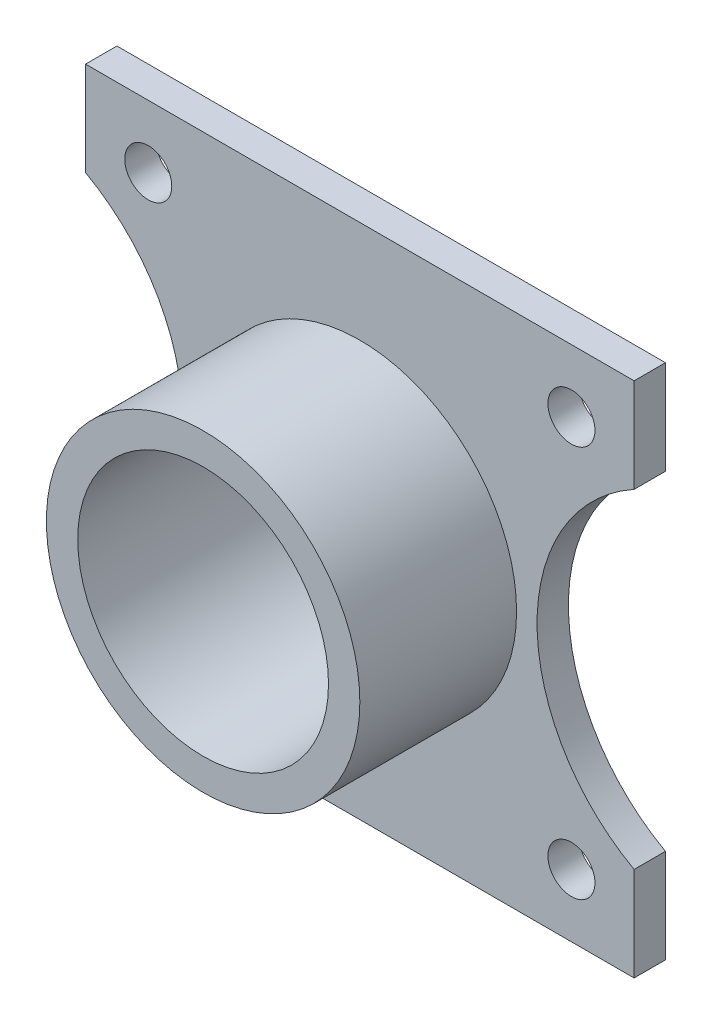
ISO-10303-21;
HEADER;
FILE_DESCRIPTION(('STEP AP214'),'2;1');
FILE_NAME('part.step','',(''),(''),'','','');
FILE_SCHEMA(('AUTOMOTIVE_DESIGN { 1 0 10303 214 1 1 1 1 }'));
ENDSEC;
DATA;
#1=APPLICATION_CONTEXT('core data for automotive mechanical design processes');
#2=APPLICATION_PROTOCOL_DEFINITION('international standard','automotive_design',2000,#1);
#3=PRODUCT_CONTEXT('',#1,'mechanical');
#4=PRODUCT('Part','Part','',(#3));
#5=PRODUCT_RELATED_PRODUCT_CATEGORY('part','',(#4));
#6=PRODUCT_DEFINITION_FORMATION('','',#4);
#7=PRODUCT_DEFINITION_CONTEXT('part definition',#1,'design');
#8=PRODUCT_DEFINITION('design','',#6,#7);
#9=PRODUCT_DEFINITION_SHAPE('','',#8);
#10=(LENGTH_UNIT() NAMED_UNIT(*) SI_UNIT(.MILLI.,.METRE.));
#11=(NAMED_UNIT(*) PLANE_ANGLE_UNIT() SI_UNIT($,.RADIAN.));
#12=(NAMED_UNIT(*) SI_UNIT($,.STERADIAN.) SOLID_ANGLE_UNIT());
#13=UNCERTAINTY_MEASURE_WITH_UNIT(LENGTH_MEASURE(1.E-05),#10,'distance_accuracy_value','');
#14=(GEOMETRIC_REPRESENTATION_CONTEXT(3) GLOBAL_UNCERTAINTY_ASSIGNED_CONTEXT((#13)) GLOBAL_UNIT_ASSIGNED_CONTEXT((#10,
#11,#12)) REPRESENTATION_CONTEXT('',''));
#15=CARTESIAN_POINT('',(0.,0.,0.));
#16=DIRECTION('',(0.,0.,1.));
#17=DIRECTION('',(1.,0.,0.));
#18=AXIS2_PLACEMENT_3D('',#15,#16,#17);
#19=CARTESIAN_POINT('',(23.3094750193111,0.,2.));
#20=DIRECTION('',(0.,0.,-1.));
#21=DIRECTION('',(-1.,0.,0.));
#22=AXIS2_PLACEMENT_3D('',#19,#20,#21);
#23=CYLINDRICAL_SURFACE('',#22,12.);
#24=CARTESIAN_POINT('',(23.3094750193111,0.,0.));
#25=DIRECTION('',(0.,0.,1.));
#26=DIRECTION('',(1.,0.,0.));
#27=AXIS2_PLACEMENT_3D('',#24,#25,#26);
#28=CIRCLE('',#27,12.);
#29=CARTESIAN_POINT('',(17.5,10.5,0.));
#30=VERTEX_POINT('',#29);
#31=CARTESIAN_POINT('',(17.5,-10.5,0.));
#32=VERTEX_POINT('',#31);
#33=EDGE_CURVE('E164',#30,#32,#28,.T.);
#34=ORIENTED_EDGE('',*,*,#33,.F.);
#35=DIRECTION('',(0.,0.,-1.));
#36=VECTOR('',#35,1.);
#37=CARTESIAN_POINT('',(17.5,10.5,2.));
#38=LINE('',#37,#36);
#39=CARTESIAN_POINT('',(17.5,10.5,2.));
#40=VERTEX_POINT('',#39);
#41=EDGE_CURVE('E48',#40,#30,#38,.T.);
#42=ORIENTED_EDGE('',*,*,#41,.F.);
#43=CARTESIAN_POINT('',(23.3094750193111,0.,2.));
#44=DIRECTION('',(0.,0.,1.));
#45=DIRECTION('',(1.,0.,0.));
#46=AXIS2_PLACEMENT_3D('',#43,#44,#45);
#47=CIRCLE('',#46,12.);
#48=CARTESIAN_POINT('',(17.5,-10.5,2.));
#49=VERTEX_POINT('',#48);
#50=EDGE_CURVE('E208',#40,#49,#47,.T.);
#51=ORIENTED_EDGE('',*,*,#50,.T.);
#52=DIRECTION('',(0.,0.,-1.));
#53=VECTOR('',#52,1.);
#54=CARTESIAN_POINT('',(17.5,-10.5,2.));
#55=LINE('',#54,#53);
#56=EDGE_CURVE('E63',#49,#32,#55,.T.);
#57=ORIENTED_EDGE('',*,*,#56,.T.);
#58=EDGE_LOOP('',(#34,#42,#51,#57));
#59=FACE_BOUND('',#58,.T.);
#60=ADVANCED_FACE('F45',(#59),#23,.F.);
#61=CARTESIAN_POINT('',(17.5,0.,2.));
#62=DIRECTION('',(1.,0.,0.));
#63=DIRECTION('',(0.,0.,-1.));
#64=AXIS2_PLACEMENT_3D('',#61,#62,#63);
#65=PLANE('',#64);
#66=DIRECTION('',(0.,-1.,0.));
#67=VECTOR('',#66,1.);
#68=CARTESIAN_POINT('',(17.5,0.,0.));
#69=LINE('',#68,#67);
#70=CARTESIAN_POINT('',(17.5,16.5,0.));
#71=VERTEX_POINT('',#70);
#72=EDGE_CURVE('E167',#71,#30,#69,.T.);
#73=ORIENTED_EDGE('',*,*,#72,.F.);
#74=DIRECTION('',(0.,0.,-1.));
#75=VECTOR('',#74,1.);
#76=CARTESIAN_POINT('',(17.5,16.5,2.));
#77=LINE('',#76,#75);
#78=CARTESIAN_POINT('',(17.5,16.5,2.));
#79=VERTEX_POINT('',#78);
#80=EDGE_CURVE('E220',#79,#71,#77,.T.);
#81=ORIENTED_EDGE('',*,*,#80,.F.);
#82=DIRECTION('',(0.,-1.,0.));
#83=VECTOR('',#82,1.);
#84=CARTESIAN_POINT('',(17.5,0.,2.));
#85=LINE('',#84,#83);
#86=EDGE_CURVE('E146',#79,#40,#85,.T.);
#87=ORIENTED_EDGE('',*,*,#86,.T.);
#88=ORIENTED_EDGE('',*,*,#41,.T.);
#89=EDGE_LOOP('',(#73,#81,#87,#88));
#90=FACE_BOUND('',#89,.T.);
#91=ADVANCED_FACE('F229',(#90),#65,.T.);
#92=CARTESIAN_POINT('',(0.,16.5,2.));
#93=DIRECTION('',(0.,1.,0.));
#94=DIRECTION('',(0.,0.,1.));
#95=AXIS2_PLACEMENT_3D('',#92,#93,#94);
#96=PLANE('',#95);
#97=DIRECTION('',(1.,0.,0.));
#98=VECTOR('',#97,1.);
#99=CARTESIAN_POINT('',(0.,16.5,0.));
#100=LINE('',#99,#98);
#101=CARTESIAN_POINT('',(-17.5,16.5,0.));
#102=VERTEX_POINT('',#101);
#103=EDGE_CURVE('E172',#102,#71,#100,.T.);
#104=ORIENTED_EDGE('',*,*,#103,.F.);
#105=DIRECTION('',(0.,0.,-1.));
#106=VECTOR('',#105,1.);
#107=CARTESIAN_POINT('',(-17.5,16.5,2.));
#108=LINE('',#107,#106);
#109=CARTESIAN_POINT('',(-17.5,16.5,2.));
#110=VERTEX_POINT('',#109);
#111=EDGE_CURVE('E218',#110,#102,#108,.T.);
#112=ORIENTED_EDGE('',*,*,#111,.F.);
#113=DIRECTION('',(1.,0.,0.));
#114=VECTOR('',#113,1.);
#115=CARTESIAN_POINT('',(0.,16.5,2.));
#116=LINE('',#115,#114);
#117=EDGE_CURVE('E239',#110,#79,#116,.T.);
#118=ORIENTED_EDGE('',*,*,#117,.T.);
#119=ORIENTED_EDGE('',*,*,#80,.T.);
#120=EDGE_LOOP('',(#104,#112,#118,#119));
#121=FACE_BOUND('',#120,.T.);
#122=ADVANCED_FACE('F237',(#121),#96,.T.);
#123=CARTESIAN_POINT('',(-17.5,0.,2.));
#124=DIRECTION('',(-1.,0.,0.));
#125=DIRECTION('',(0.,0.,1.));
#126=AXIS2_PLACEMENT_3D('',#123,#124,#125);
#127=PLANE('',#126);
#128=DIRECTION('',(0.,1.,0.));
#129=VECTOR('',#128,1.);
#130=CARTESIAN_POINT('',(-17.5,0.,0.));
#131=LINE('',#130,#129);
#132=CARTESIAN_POINT('',(-17.5,10.5,0.));
#133=VERTEX_POINT('',#132);
#134=EDGE_CURVE('E177',#133,#102,#131,.T.);
#135=ORIENTED_EDGE('',*,*,#134,.F.);
#136=DIRECTION('',(0.,0.,-1.));
#137=VECTOR('',#136,1.);
#138=CARTESIAN_POINT('',(-17.5,10.5,2.));
#139=LINE('',#138,#137);
#140=CARTESIAN_POINT('',(-17.5,10.5,2.));
#141=VERTEX_POINT('',#140);
#142=EDGE_CURVE('E215',#141,#133,#139,.T.);
#143=ORIENTED_EDGE('',*,*,#142,.F.);
#144=DIRECTION('',(0.,1.,0.));
#145=VECTOR('',#144,1.);
#146=CARTESIAN_POINT('',(-17.5,0.,2.));
#147=LINE('',#146,#145);
#148=EDGE_CURVE('E138',#141,#110,#147,.T.);
#149=ORIENTED_EDGE('',*,*,#148,.T.);
#150=ORIENTED_EDGE('',*,*,#111,.T.);
#151=EDGE_LOOP('',(#135,#143,#149,#150));
#152=FACE_BOUND('',#151,.T.);
#153=ADVANCED_FACE('F244',(#152),#127,.T.);
#154=CARTESIAN_POINT('',(-23.3094750193111,0.,2.));
#155=DIRECTION('',(0.,0.,-1.));
#156=DIRECTION('',(-1.,0.,0.));
#157=AXIS2_PLACEMENT_3D('',#154,#155,#156);
#158=CYLINDRICAL_SURFACE('',#157,12.);
#159=CARTESIAN_POINT('',(-23.3094750193111,0.,0.));
#160=DIRECTION('',(0.,0.,1.));
#161=DIRECTION('',(1.,0.,0.));
#162=AXIS2_PLACEMENT_3D('',#159,#160,#161);
#163=CIRCLE('',#162,12.);
#164=CARTESIAN_POINT('',(-17.5,-10.5,0.));
#165=VERTEX_POINT('',#164);
#166=EDGE_CURVE('E181',#133,#165,#163,.F.);
#167=ORIENTED_EDGE('',*,*,#166,.T.);
#168=DIRECTION('',(0.,0.,-1.));
#169=VECTOR('',#168,1.);
#170=CARTESIAN_POINT('',(-17.5,-10.5,2.));
#171=LINE('',#170,#169);
#172=CARTESIAN_POINT('',(-17.5,-10.5,2.));
#173=VERTEX_POINT('',#172);
#174=EDGE_CURVE('E124',#173,#165,#171,.T.);
#175=ORIENTED_EDGE('',*,*,#174,.F.);
#176=CARTESIAN_POINT('',(-23.3094750193111,0.,2.));
#177=DIRECTION('',(0.,0.,1.));
#178=DIRECTION('',(1.,0.,0.));
#179=AXIS2_PLACEMENT_3D('',#176,#177,#178);
#180=CIRCLE('',#179,12.);
#181=EDGE_CURVE('E134',#141,#173,#180,.F.);
#182=ORIENTED_EDGE('',*,*,#181,.F.);
#183=ORIENTED_EDGE('',*,*,#142,.T.);
#184=EDGE_LOOP('',(#167,#175,#182,#183));
#185=FACE_BOUND('',#184,.T.);
#186=ADVANCED_FACE('F297',(#185),#158,.F.);
#187=CARTESIAN_POINT('',(-17.5,-16.5,0.));
#188=VERTEX_POINT('',#187);
#189=EDGE_CURVE('E119',#188,#165,#131,.T.);
#190=ORIENTED_EDGE('',*,*,#189,.F.);
#191=DIRECTION('',(0.,0.,-1.));
#192=VECTOR('',#191,1.);
#193=CARTESIAN_POINT('',(-17.5,-16.5,2.));
#194=LINE('',#193,#192);
#195=CARTESIAN_POINT('',(-17.5,-16.5,2.));
#196=VERTEX_POINT('',#195);
#197=EDGE_CURVE('E114',#196,#188,#194,.T.);
#198=ORIENTED_EDGE('',*,*,#197,.F.);
#199=EDGE_CURVE('E117',#196,#173,#147,.T.);
#200=ORIENTED_EDGE('',*,*,#199,.T.);
#201=ORIENTED_EDGE('',*,*,#174,.T.);
#202=EDGE_LOOP('',(#190,#198,#200,#201));
#203=FACE_BOUND('',#202,.T.);
#204=ADVANCED_FACE('F116',(#203),#127,.T.);
#205=CARTESIAN_POINT('',(0.,-16.5,2.));
#206=DIRECTION('',(0.,-1.,0.));
#207=DIRECTION('',(1.,0.,0.));
#208=AXIS2_PLACEMENT_3D('',#205,#206,#207);
#209=PLANE('',#208);
#210=DIRECTION('',(-1.,0.,0.));
#211=VECTOR('',#210,1.);
#212=CARTESIAN_POINT('',(0.,-16.5,0.));
#213=LINE('',#212,#211);
#214=CARTESIAN_POINT('',(17.5,-16.5,0.));
#215=VERTEX_POINT('',#214);
#216=EDGE_CURVE('E185',#215,#188,#213,.T.);
#217=ORIENTED_EDGE('',*,*,#216,.F.);
#218=DIRECTION('',(0.,0.,-1.));
#219=VECTOR('',#218,1.);
#220=CARTESIAN_POINT('',(17.5,-16.5,2.));
#221=LINE('',#220,#219);
#222=CARTESIAN_POINT('',(17.5,-16.5,2.));
#223=VERTEX_POINT('',#222);
#224=EDGE_CURVE('E89',#223,#215,#221,.T.);
#225=ORIENTED_EDGE('',*,*,#224,.F.);
#226=DIRECTION('',(-1.,0.,0.));
#227=VECTOR('',#226,1.);
#228=CARTESIAN_POINT('',(0.,-16.5,2.));
#229=LINE('',#228,#227);
#230=EDGE_CURVE('E131',#223,#196,#229,.T.);
#231=ORIENTED_EDGE('',*,*,#230,.T.);
#232=ORIENTED_EDGE('',*,*,#197,.T.);
#233=EDGE_LOOP('',(#217,#225,#231,#232));
#234=FACE_BOUND('',#233,.T.);
#235=ADVANCED_FACE('F139',(#234),#209,.T.);
#236=CARTESIAN_POINT('',(-13.5,12.5,2.));
#237=DIRECTION('',(0.,0.,-1.));
#238=DIRECTION('',(-1.,0.,0.));
#239=AXIS2_PLACEMENT_3D('',#236,#237,#238);
#240=CYLINDRICAL_SURFACE('',#239,1.5);
#241=CARTESIAN_POINT('',(-13.5,12.5,2.));
#242=DIRECTION('',(0.,0.,1.));
#243=DIRECTION('',(1.,0.,0.));
#244=AXIS2_PLACEMENT_3D('',#241,#242,#243);
#245=CIRCLE('',#244,1.5);
#246=CARTESIAN_POINT('',(-12.,12.5,2.));
#247=VERTEX_POINT('',#246);
#248=EDGE_CURVE('E156',#247,#247,#245,.T.);
#249=ORIENTED_EDGE('',*,*,#248,.T.);
#250=EDGE_LOOP('',(#249));
#251=FACE_BOUND('',#250,.T.);
#252=CARTESIAN_POINT('',(-13.5,12.5,0.));
#253=DIRECTION('',(0.,0.,1.));
#254=DIRECTION('',(1.,0.,0.));
#255=AXIS2_PLACEMENT_3D('',#252,#253,#254);
#256=CIRCLE('',#255,1.5);
#257=CARTESIAN_POINT('',(-12.,12.5,0.));
#258=VERTEX_POINT('',#257);
#259=EDGE_CURVE('E200',#258,#258,#256,.T.);
#260=ORIENTED_EDGE('',*,*,#259,.F.);
#261=EDGE_LOOP('',(#260));
#262=FACE_BOUND('',#261,.T.);
#263=ADVANCED_FACE('F306',(#251,#262),#240,.F.);
#264=CARTESIAN_POINT('',(-13.5,-12.5,2.));
#265=DIRECTION('',(0.,0.,-1.));
#266=DIRECTION('',(-1.,0.,0.));
#267=AXIS2_PLACEMENT_3D('',#264,#265,#266);
#268=CYLINDRICAL_SURFACE('',#267,1.5);
#269=CARTESIAN_POINT('',(-13.5,-12.5,2.));
#270=DIRECTION('',(0.,0.,1.));
#271=DIRECTION('',(1.,0.,0.));
#272=AXIS2_PLACEMENT_3D('',#269,#270,#271);
#273=CIRCLE('',#272,1.5);
#274=CARTESIAN_POINT('',(-12.,-12.5,2.));
#275=VERTEX_POINT('',#274);
#276=EDGE_CURVE('E152',#275,#275,#273,.T.);
#277=ORIENTED_EDGE('',*,*,#276,.T.);
#278=EDGE_LOOP('',(#277));
#279=FACE_BOUND('',#278,.T.);
#280=CARTESIAN_POINT('',(-13.5,-12.5,0.));
#281=DIRECTION('',(0.,0.,1.));
#282=DIRECTION('',(1.,0.,0.));
#283=AXIS2_PLACEMENT_3D('',#280,#281,#282);
#284=CIRCLE('',#283,1.5);
#285=CARTESIAN_POINT('',(-12.,-12.5,0.));
#286=VERTEX_POINT('',#285);
#287=EDGE_CURVE('E196',#286,#286,#284,.T.);
#288=ORIENTED_EDGE('',*,*,#287,.F.);
#289=EDGE_LOOP('',(#288));
#290=FACE_BOUND('',#289,.T.);
#291=ADVANCED_FACE('F310',(#279,#290),#268,.F.);
#292=CARTESIAN_POINT('',(13.5,-12.5,2.));
#293=DIRECTION('',(0.,0.,-1.));
#294=DIRECTION('',(-1.,0.,0.));
#295=AXIS2_PLACEMENT_3D('',#292,#293,#294);
#296=CYLINDRICAL_SURFACE('',#295,1.5);
#297=CARTESIAN_POINT('',(13.5,-12.5,2.));
#298=DIRECTION('',(0.,0.,1.));
#299=DIRECTION('',(1.,0.,0.));
#300=AXIS2_PLACEMENT_3D('',#297,#298,#299);
#301=CIRCLE('',#300,1.5);
#302=CARTESIAN_POINT('',(15.,-12.5,2.));
#303=VERTEX_POINT('',#302);
#304=EDGE_CURVE('E144',#303,#303,#301,.T.);
#305=ORIENTED_EDGE('',*,*,#304,.T.);
#306=EDGE_LOOP('',(#305));
#307=FACE_BOUND('',#306,.T.);
#308=CARTESIAN_POINT('',(13.5,-12.5,0.));
#309=DIRECTION('',(0.,0.,1.));
#310=DIRECTION('',(1.,0.,0.));
#311=AXIS2_PLACEMENT_3D('',#308,#309,#310);
#312=CIRCLE('',#311,1.5);
#313=CARTESIAN_POINT('',(15.,-12.5,0.));
#314=VERTEX_POINT('',#313);
#315=EDGE_CURVE('E192',#314,#314,#312,.T.);
#316=ORIENTED_EDGE('',*,*,#315,.F.);
#317=EDGE_LOOP('',(#316));
#318=FACE_BOUND('',#317,.T.);
#319=ADVANCED_FACE('F292',(#307,#318),#296,.F.);
#320=CARTESIAN_POINT('',(0.,0.,2.));
#321=DIRECTION('',(0.,0.,-1.));
#322=DIRECTION('',(-1.,0.,0.));
#323=AXIS2_PLACEMENT_3D('',#320,#321,#322);
#324=CYLINDRICAL_SURFACE('',#323,8.);
#325=CARTESIAN_POINT('',(0.,0.,0.));
#326=DIRECTION('',(0.,0.,1.));
#327=DIRECTION('',(1.,0.,0.));
#328=AXIS2_PLACEMENT_3D('',#325,#326,#327);
#329=CIRCLE('',#328,8.);
#330=CARTESIAN_POINT('',(8.,0.,0.));
#331=VERTEX_POINT('',#330);
#332=EDGE_CURVE('E188',#331,#331,#329,.T.);
#333=ORIENTED_EDGE('',*,*,#332,.F.);
#334=EDGE_LOOP('',(#333));
#335=FACE_BOUND('',#334,.T.);
#336=CARTESIAN_POINT('',(0.,0.,12.));
#337=DIRECTION('',(0.,0.,1.));
#338=DIRECTION('',(1.,0.,0.));
#339=AXIS2_PLACEMENT_3D('',#336,#337,#338);
#340=CIRCLE('',#339,8.);
#341=CARTESIAN_POINT('',(8.,0.,12.));
#342=VERTEX_POINT('',#341);
#343=EDGE_CURVE('E254',#342,#342,#340,.T.);
#344=ORIENTED_EDGE('',*,*,#343,.T.);
#345=EDGE_LOOP('',(#344));
#346=FACE_BOUND('',#345,.T.);
#347=ADVANCED_FACE('F259',(#335,#346),#324,.F.);
#348=EDGE_CURVE('E173',#32,#215,#69,.T.);
#349=ORIENTED_EDGE('',*,*,#348,.F.);
#350=ORIENTED_EDGE('',*,*,#56,.F.);
#351=EDGE_CURVE('E141',#49,#223,#85,.T.);
#352=ORIENTED_EDGE('',*,*,#351,.T.);
#353=ORIENTED_EDGE('',*,*,#224,.T.);
#354=EDGE_LOOP('',(#349,#350,#352,#353));
#355=FACE_BOUND('',#354,.T.);
#356=ADVANCED_FACE('F278',(#355),#65,.T.);
#357=CARTESIAN_POINT('',(13.5,12.5,2.));
#358=DIRECTION('',(0.,0.,-1.));
#359=DIRECTION('',(-1.,0.,0.));
#360=AXIS2_PLACEMENT_3D('',#357,#358,#359);
#361=CYLINDRICAL_SURFACE('',#360,1.5);
#362=CARTESIAN_POINT('',(13.5,12.5,2.));
#363=DIRECTION('',(0.,0.,1.));
#364=DIRECTION('',(1.,0.,0.));
#365=AXIS2_PLACEMENT_3D('',#362,#363,#364);
#366=CIRCLE('',#365,1.5);
#367=CARTESIAN_POINT('',(15.,12.5,2.));
#368=VERTEX_POINT('',#367);
#369=EDGE_CURVE('E160',#368,#368,#366,.T.);
#370=ORIENTED_EDGE('',*,*,#369,.T.);
#371=EDGE_LOOP('',(#370));
#372=FACE_BOUND('',#371,.T.);
#373=CARTESIAN_POINT('',(13.5,12.5,0.));
#374=DIRECTION('',(0.,0.,1.));
#375=DIRECTION('',(1.,0.,0.));
#376=AXIS2_PLACEMENT_3D('',#373,#374,#375);
#377=CIRCLE('',#376,1.5);
#378=CARTESIAN_POINT('',(15.,12.5,0.));
#379=VERTEX_POINT('',#378);
#380=EDGE_CURVE('E204',#379,#379,#377,.T.);
#381=ORIENTED_EDGE('',*,*,#380,.F.);
#382=EDGE_LOOP('',(#381));
#383=FACE_BOUND('',#382,.T.);
#384=ADVANCED_FACE('F285',(#372,#383),#361,.F.);
#385=CARTESIAN_POINT('',(0.,0.,2.));
#386=DIRECTION('',(0.,0.,1.));
#387=DIRECTION('',(1.,0.,0.));
#388=AXIS2_PLACEMENT_3D('',#385,#386,#387);
#389=PLANE('',#388);
#390=CARTESIAN_POINT('',(0.,0.,2.));
#391=DIRECTION('',(0.,0.,1.));
#392=DIRECTION('',(1.,0.,0.));
#393=AXIS2_PLACEMENT_3D('',#390,#391,#392);
#394=CIRCLE('',#393,10.);
#395=CARTESIAN_POINT('',(10.,0.,2.));
#396=VERTEX_POINT('',#395);
#397=EDGE_CURVE('E11',#396,#396,#394,.T.);
#398=ORIENTED_EDGE('',*,*,#397,.F.);
#399=EDGE_LOOP('',(#398));
#400=FACE_BOUND('',#399,.T.);
#401=ORIENTED_EDGE('',*,*,#50,.F.);
#402=ORIENTED_EDGE('',*,*,#86,.F.);
#403=ORIENTED_EDGE('',*,*,#117,.F.);
#404=ORIENTED_EDGE('',*,*,#148,.F.);
#405=ORIENTED_EDGE('',*,*,#181,.T.);
#406=ORIENTED_EDGE('',*,*,#199,.F.);
#407=ORIENTED_EDGE('',*,*,#230,.F.);
#408=ORIENTED_EDGE('',*,*,#351,.F.);
#409=EDGE_LOOP('',(#401,#402,#403,#404,#405,#406,#407,#408));
#410=FACE_BOUND('',#409,.T.);
#411=ORIENTED_EDGE('',*,*,#304,.F.);
#412=EDGE_LOOP('',(#411));
#413=FACE_BOUND('',#412,.T.);
#414=ORIENTED_EDGE('',*,*,#276,.F.);
#415=EDGE_LOOP('',(#414));
#416=FACE_BOUND('',#415,.T.);
#417=ORIENTED_EDGE('',*,*,#248,.F.);
#418=EDGE_LOOP('',(#417));
#419=FACE_BOUND('',#418,.T.);
#420=ORIENTED_EDGE('',*,*,#369,.F.);
#421=EDGE_LOOP('',(#420));
#422=FACE_BOUND('',#421,.T.);
#423=ADVANCED_FACE('F128',(#400,#410,#413,#416,#419,#422),#389,.T.);
#424=CARTESIAN_POINT('',(0.,0.,0.));
#425=DIRECTION('',(0.,0.,1.));
#426=DIRECTION('',(1.,0.,0.));
#427=AXIS2_PLACEMENT_3D('',#424,#425,#426);
#428=PLANE('',#427);
#429=ORIENTED_EDGE('',*,*,#33,.T.);
#430=ORIENTED_EDGE('',*,*,#348,.T.);
#431=ORIENTED_EDGE('',*,*,#216,.T.);
#432=ORIENTED_EDGE('',*,*,#189,.T.);
#433=ORIENTED_EDGE('',*,*,#166,.F.);
#434=ORIENTED_EDGE('',*,*,#134,.T.);
#435=ORIENTED_EDGE('',*,*,#103,.T.);
#436=ORIENTED_EDGE('',*,*,#72,.T.);
#437=EDGE_LOOP('',(#429,#430,#431,#432,#433,#434,#435,#436));
#438=FACE_BOUND('',#437,.T.);
#439=ORIENTED_EDGE('',*,*,#332,.T.);
#440=EDGE_LOOP('',(#439));
#441=FACE_BOUND('',#440,.T.);
#442=ORIENTED_EDGE('',*,*,#315,.T.);
#443=EDGE_LOOP('',(#442));
#444=FACE_BOUND('',#443,.T.);
#445=ORIENTED_EDGE('',*,*,#287,.T.);
#446=EDGE_LOOP('',(#445));
#447=FACE_BOUND('',#446,.T.);
#448=ORIENTED_EDGE('',*,*,#259,.T.);
#449=EDGE_LOOP('',(#448));
#450=FACE_BOUND('',#449,.T.);
#451=ORIENTED_EDGE('',*,*,#380,.T.);
#452=EDGE_LOOP('',(#451));
#453=FACE_BOUND('',#452,.T.);
#454=ADVANCED_FACE('F233',(#438,#441,#444,#447,#450,#453),#428,.F.);
#455=CARTESIAN_POINT('',(0.,0.,12.));
#456=DIRECTION('',(0.,0.,1.));
#457=DIRECTION('',(1.,0.,0.));
#458=AXIS2_PLACEMENT_3D('',#455,#456,#457);
#459=PLANE('',#458);
#460=CARTESIAN_POINT('',(0.,0.,12.));
#461=DIRECTION('',(0.,0.,1.));
#462=DIRECTION('',(1.,0.,0.));
#463=AXIS2_PLACEMENT_3D('',#460,#461,#462);
#464=CIRCLE('',#463,10.);
#465=CARTESIAN_POINT('',(10.,0.,12.));
#466=VERTEX_POINT('',#465);
#467=EDGE_CURVE('E168',#466,#466,#464,.T.);
#468=ORIENTED_EDGE('',*,*,#467,.T.);
#469=EDGE_LOOP('',(#468));
#470=FACE_BOUND('',#469,.T.);
#471=ORIENTED_EDGE('',*,*,#343,.F.);
#472=EDGE_LOOP('',(#471));
#473=FACE_BOUND('',#472,.T.);
#474=ADVANCED_FACE('F261',(#470,#473),#459,.T.);
#475=CARTESIAN_POINT('',(0.,0.,12.));
#476=DIRECTION('',(0.,0.,-1.));
#477=DIRECTION('',(-1.,0.,0.));
#478=AXIS2_PLACEMENT_3D('',#475,#476,#477);
#479=CYLINDRICAL_SURFACE('',#478,10.);
#480=ORIENTED_EDGE('',*,*,#467,.F.);
#481=EDGE_LOOP('',(#480));
#482=FACE_BOUND('',#481,.T.);
#483=ORIENTED_EDGE('',*,*,#397,.T.);
#484=EDGE_LOOP('',(#483));
#485=FACE_BOUND('',#484,.T.);
#486=ADVANCED_FACE('F263',(#482,#485),#479,.T.);
#487=CLOSED_SHELL('',(#60,#91,#122,#153,#186,#204,#235,#263,#291,#319,#347,#356,#384,#423,#454,
#474,#486));
#488=MANIFOLD_SOLID_BREP('B2',#487);
#489=ADVANCED_BREP_SHAPE_REPRESENTATION('',(#18,#488),#14);
#490=SHAPE_DEFINITION_REPRESENTATION(#9,#489);
ENDSEC;
END-ISO-10303-21;
